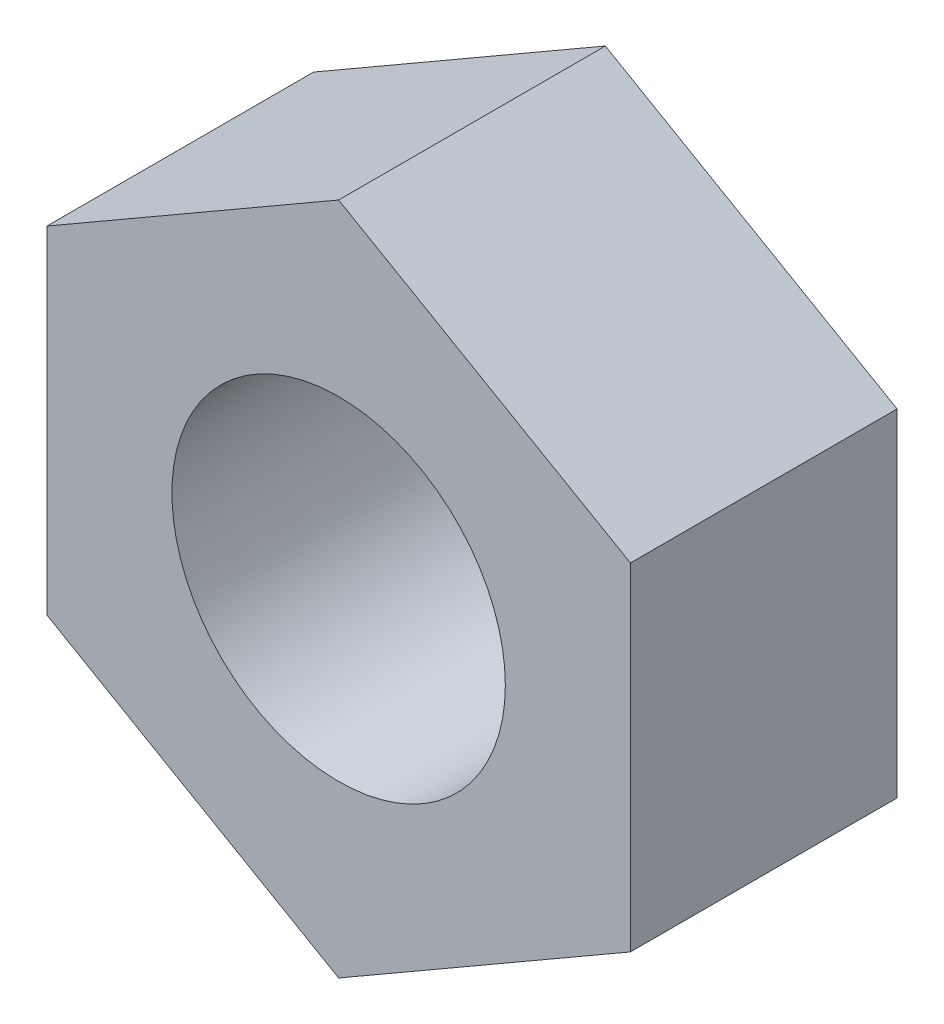
ISO-10303-21;
HEADER;
FILE_DESCRIPTION(('STEP AP214'),'2;1');
FILE_NAME('part.step','',(''),(''),'','','');
FILE_SCHEMA(('AUTOMOTIVE_DESIGN { 1 0 10303 214 1 1 1 1 }'));
ENDSEC;
DATA;
#1=APPLICATION_CONTEXT('core data for automotive mechanical design processes');
#2=APPLICATION_PROTOCOL_DEFINITION('international standard','automotive_design',2000,#1);
#3=PRODUCT_CONTEXT('',#1,'mechanical');
#4=PRODUCT('Part','Part','',(#3));
#5=PRODUCT_RELATED_PRODUCT_CATEGORY('part','',(#4));
#6=PRODUCT_DEFINITION_FORMATION('','',#4);
#7=PRODUCT_DEFINITION_CONTEXT('part definition',#1,'design');
#8=PRODUCT_DEFINITION('design','',#6,#7);
#9=PRODUCT_DEFINITION_SHAPE('','',#8);
#10=(LENGTH_UNIT() NAMED_UNIT(*) SI_UNIT(.MILLI.,.METRE.));
#11=(NAMED_UNIT(*) PLANE_ANGLE_UNIT() SI_UNIT($,.RADIAN.));
#12=(NAMED_UNIT(*) SI_UNIT($,.STERADIAN.) SOLID_ANGLE_UNIT());
#13=UNCERTAINTY_MEASURE_WITH_UNIT(LENGTH_MEASURE(1.E-05),#10,'distance_accuracy_value','');
#14=(GEOMETRIC_REPRESENTATION_CONTEXT(3) GLOBAL_UNCERTAINTY_ASSIGNED_CONTEXT((#13)) GLOBAL_UNIT_ASSIGNED_CONTEXT((#10,
#11,#12)) REPRESENTATION_CONTEXT('',''));
#15=CARTESIAN_POINT('',(0.,0.,0.));
#16=DIRECTION('',(0.,0.,1.));
#17=DIRECTION('',(1.,0.,0.));
#18=AXIS2_PLACEMENT_3D('',#15,#16,#17);
#19=CARTESIAN_POINT('',(0.,0.,2.4));
#20=DIRECTION('',(0.,0.,1.));
#21=DIRECTION('',(1.,0.,0.));
#22=AXIS2_PLACEMENT_3D('',#19,#20,#21);
#23=PLANE('',#22);
#24=DIRECTION('',(-0.866025403784439,0.5,0.));
#25=VECTOR('',#24,1.);
#26=CARTESIAN_POINT('',(2.625,1.51554445662277,2.4));
#27=LINE('',#26,#25);
#28=CARTESIAN_POINT('',(2.625,1.51554445662277,2.4));
#29=VERTEX_POINT('',#28);
#30=CARTESIAN_POINT('',(0.,3.03108891324554,2.4));
#31=VERTEX_POINT('',#30);
#32=EDGE_CURVE('E152',#29,#31,#27,.T.);
#33=ORIENTED_EDGE('',*,*,#32,.T.);
#34=DIRECTION('',(-0.866025403784439,-0.5,0.));
#35=VECTOR('',#34,1.);
#36=CARTESIAN_POINT('',(0.,3.03108891324554,2.4));
#37=LINE('',#36,#35);
#38=CARTESIAN_POINT('',(-2.625,1.51554445662277,2.4));
#39=VERTEX_POINT('',#38);
#40=EDGE_CURVE('E100',#31,#39,#37,.T.);
#41=ORIENTED_EDGE('',*,*,#40,.T.);
#42=DIRECTION('',(0.,-1.,0.));
#43=VECTOR('',#42,1.);
#44=CARTESIAN_POINT('',(-2.625,1.51554445662277,2.4));
#45=LINE('',#44,#43);
#46=CARTESIAN_POINT('',(-2.625,-1.51554445662277,2.4));
#47=VERTEX_POINT('',#46);
#48=EDGE_CURVE('E113',#39,#47,#45,.T.);
#49=ORIENTED_EDGE('',*,*,#48,.T.);
#50=DIRECTION('',(0.866025403784439,-0.5,0.));
#51=VECTOR('',#50,1.);
#52=CARTESIAN_POINT('',(-2.625,-1.51554445662277,2.4));
#53=LINE('',#52,#51);
#54=CARTESIAN_POINT('',(0.,-3.03108891324554,2.4));
#55=VERTEX_POINT('',#54);
#56=EDGE_CURVE('E107',#47,#55,#53,.T.);
#57=ORIENTED_EDGE('',*,*,#56,.T.);
#58=DIRECTION('',(0.866025403784439,0.5,0.));
#59=VECTOR('',#58,1.);
#60=CARTESIAN_POINT('',(0.,-3.03108891324554,2.4));
#61=LINE('',#60,#59);
#62=CARTESIAN_POINT('',(2.625,-1.51554445662277,2.4));
#63=VERTEX_POINT('',#62);
#64=EDGE_CURVE('E111',#55,#63,#61,.T.);
#65=ORIENTED_EDGE('',*,*,#64,.T.);
#66=DIRECTION('',(0.,1.,0.));
#67=VECTOR('',#66,1.);
#68=CARTESIAN_POINT('',(2.625,-1.51554445662277,2.4));
#69=LINE('',#68,#67);
#70=EDGE_CURVE('E63',#63,#29,#69,.T.);
#71=ORIENTED_EDGE('',*,*,#70,.T.);
#72=EDGE_LOOP('',(#33,#41,#49,#57,#65,#71));
#73=FACE_BOUND('',#72,.T.);
#74=CARTESIAN_POINT('',(0.,0.,2.4));
#75=DIRECTION('',(0.,0.,1.));
#76=DIRECTION('',(1.,0.,0.));
#77=AXIS2_PLACEMENT_3D('',#74,#75,#76);
#78=CIRCLE('',#77,1.50000000000006);
#79=CARTESIAN_POINT('',(1.50000000000006,0.,2.4));
#80=VERTEX_POINT('',#79);
#81=EDGE_CURVE('E140',#80,#80,#78,.T.);
#82=ORIENTED_EDGE('',*,*,#81,.F.);
#83=EDGE_LOOP('',(#82));
#84=FACE_BOUND('',#83,.T.);
#85=ADVANCED_FACE('F45',(#73,#84),#23,.T.);
#86=CARTESIAN_POINT('',(0.,0.,0.));
#87=DIRECTION('',(0.,0.,1.));
#88=DIRECTION('',(1.,0.,0.));
#89=AXIS2_PLACEMENT_3D('',#86,#87,#88);
#90=PLANE('',#89);
#91=DIRECTION('',(-0.866025403784439,0.5,0.));
#92=VECTOR('',#91,1.);
#93=CARTESIAN_POINT('',(2.625,1.51554445662277,0.));
#94=LINE('',#93,#92);
#95=CARTESIAN_POINT('',(2.625,1.51554445662277,0.));
#96=VERTEX_POINT('',#95);
#97=CARTESIAN_POINT('',(0.,3.03108891324554,0.));
#98=VERTEX_POINT('',#97);
#99=EDGE_CURVE('E135',#96,#98,#94,.T.);
#100=ORIENTED_EDGE('',*,*,#99,.F.);
#101=DIRECTION('',(0.,1.,0.));
#102=VECTOR('',#101,1.);
#103=CARTESIAN_POINT('',(2.625,-1.51554445662277,0.));
#104=LINE('',#103,#102);
#105=CARTESIAN_POINT('',(2.625,-1.51554445662277,0.));
#106=VERTEX_POINT('',#105);
#107=EDGE_CURVE('E92',#106,#96,#104,.T.);
#108=ORIENTED_EDGE('',*,*,#107,.F.);
#109=DIRECTION('',(0.866025403784439,0.5,0.));
#110=VECTOR('',#109,1.);
#111=CARTESIAN_POINT('',(0.,-3.03108891324554,0.));
#112=LINE('',#111,#110);
#113=CARTESIAN_POINT('',(0.,-3.03108891324554,0.));
#114=VERTEX_POINT('',#113);
#115=EDGE_CURVE('E86',#114,#106,#112,.T.);
#116=ORIENTED_EDGE('',*,*,#115,.F.);
#117=DIRECTION('',(0.866025403784439,-0.5,0.));
#118=VECTOR('',#117,1.);
#119=CARTESIAN_POINT('',(-2.625,-1.51554445662277,0.));
#120=LINE('',#119,#118);
#121=CARTESIAN_POINT('',(-2.625,-1.51554445662277,0.));
#122=VERTEX_POINT('',#121);
#123=EDGE_CURVE('E122',#122,#114,#120,.T.);
#124=ORIENTED_EDGE('',*,*,#123,.F.);
#125=DIRECTION('',(0.,-1.,0.));
#126=VECTOR('',#125,1.);
#127=CARTESIAN_POINT('',(-2.625,1.51554445662277,0.));
#128=LINE('',#127,#126);
#129=CARTESIAN_POINT('',(-2.625,1.51554445662277,0.));
#130=VERTEX_POINT('',#129);
#131=EDGE_CURVE('E143',#130,#122,#128,.T.);
#132=ORIENTED_EDGE('',*,*,#131,.F.);
#133=DIRECTION('',(-0.866025403784439,-0.5,0.));
#134=VECTOR('',#133,1.);
#135=CARTESIAN_POINT('',(0.,3.03108891324554,0.));
#136=LINE('',#135,#134);
#137=EDGE_CURVE('E139',#98,#130,#136,.T.);
#138=ORIENTED_EDGE('',*,*,#137,.F.);
#139=EDGE_LOOP('',(#100,#108,#116,#124,#132,#138));
#140=FACE_BOUND('',#139,.T.);
#141=CARTESIAN_POINT('',(0.,0.,0.));
#142=DIRECTION('',(0.,0.,1.));
#143=DIRECTION('',(1.,0.,0.));
#144=AXIS2_PLACEMENT_3D('',#141,#142,#143);
#145=CIRCLE('',#144,1.50000000000006);
#146=CARTESIAN_POINT('',(1.50000000000006,0.,0.));
#147=VERTEX_POINT('',#146);
#148=EDGE_CURVE('E249',#147,#147,#145,.T.);
#149=ORIENTED_EDGE('',*,*,#148,.T.);
#150=EDGE_LOOP('',(#149));
#151=FACE_BOUND('',#150,.T.);
#152=ADVANCED_FACE('F165',(#140,#151),#90,.F.);
#153=CARTESIAN_POINT('',(2.625,1.51554445662277,2.4));
#154=DIRECTION('',(-0.5,-0.866025403784439,0.));
#155=DIRECTION('',(0.866025403784439,-0.5,0.));
#156=AXIS2_PLACEMENT_3D('',#153,#154,#155);
#157=PLANE('',#156);
#158=ORIENTED_EDGE('',*,*,#99,.T.);
#159=DIRECTION('',(0.,0.,-1.));
#160=VECTOR('',#159,1.);
#161=CARTESIAN_POINT('',(0.,3.03108891324554,2.4));
#162=LINE('',#161,#160);
#163=EDGE_CURVE('E11',#31,#98,#162,.T.);
#164=ORIENTED_EDGE('',*,*,#163,.F.);
#165=ORIENTED_EDGE('',*,*,#32,.F.);
#166=DIRECTION('',(0.,0.,-1.));
#167=VECTOR('',#166,1.);
#168=CARTESIAN_POINT('',(2.625,1.51554445662277,2.4));
#169=LINE('',#168,#167);
#170=EDGE_CURVE('E131',#29,#96,#169,.T.);
#171=ORIENTED_EDGE('',*,*,#170,.T.);
#172=EDGE_LOOP('',(#158,#164,#165,#171));
#173=FACE_BOUND('',#172,.T.);
#174=ADVANCED_FACE('F47',(#173),#157,.F.);
#175=CARTESIAN_POINT('',(0.,3.03108891324554,2.4));
#176=DIRECTION('',(0.5,-0.866025403784439,0.));
#177=DIRECTION('',(0.866025403784439,0.5,0.));
#178=AXIS2_PLACEMENT_3D('',#175,#176,#177);
#179=PLANE('',#178);
#180=ORIENTED_EDGE('',*,*,#137,.T.);
#181=DIRECTION('',(0.,0.,-1.));
#182=VECTOR('',#181,1.);
#183=CARTESIAN_POINT('',(-2.625,1.51554445662277,2.4));
#184=LINE('',#183,#182);
#185=EDGE_CURVE('E55',#39,#130,#184,.T.);
#186=ORIENTED_EDGE('',*,*,#185,.F.);
#187=ORIENTED_EDGE('',*,*,#40,.F.);
#188=ORIENTED_EDGE('',*,*,#163,.T.);
#189=EDGE_LOOP('',(#180,#186,#187,#188));
#190=FACE_BOUND('',#189,.T.);
#191=ADVANCED_FACE('F190',(#190),#179,.F.);
#192=CARTESIAN_POINT('',(-2.625,1.51554445662277,2.4));
#193=DIRECTION('',(1.,0.,0.));
#194=DIRECTION('',(0.,0.,-1.));
#195=AXIS2_PLACEMENT_3D('',#192,#193,#194);
#196=PLANE('',#195);
#197=ORIENTED_EDGE('',*,*,#131,.T.);
#198=DIRECTION('',(0.,0.,-1.));
#199=VECTOR('',#198,1.);
#200=CARTESIAN_POINT('',(-2.625,-1.51554445662277,2.4));
#201=LINE('',#200,#199);
#202=EDGE_CURVE('E124',#47,#122,#201,.T.);
#203=ORIENTED_EDGE('',*,*,#202,.F.);
#204=ORIENTED_EDGE('',*,*,#48,.F.);
#205=ORIENTED_EDGE('',*,*,#185,.T.);
#206=EDGE_LOOP('',(#197,#203,#204,#205));
#207=FACE_BOUND('',#206,.T.);
#208=ADVANCED_FACE('F162',(#207),#196,.F.);
#209=CARTESIAN_POINT('',(-2.625,-1.51554445662277,2.4));
#210=DIRECTION('',(0.5,0.866025403784439,0.));
#211=DIRECTION('',(-0.866025403784439,0.5,0.));
#212=AXIS2_PLACEMENT_3D('',#209,#210,#211);
#213=PLANE('',#212);
#214=ORIENTED_EDGE('',*,*,#123,.T.);
#215=DIRECTION('',(0.,0.,-1.));
#216=VECTOR('',#215,1.);
#217=CARTESIAN_POINT('',(0.,-3.03108891324554,2.4));
#218=LINE('',#217,#216);
#219=EDGE_CURVE('E119',#55,#114,#218,.T.);
#220=ORIENTED_EDGE('',*,*,#219,.F.);
#221=ORIENTED_EDGE('',*,*,#56,.F.);
#222=ORIENTED_EDGE('',*,*,#202,.T.);
#223=EDGE_LOOP('',(#214,#220,#221,#222));
#224=FACE_BOUND('',#223,.T.);
#225=ADVANCED_FACE('F120',(#224),#213,.F.);
#226=CARTESIAN_POINT('',(0.,-3.03108891324554,2.4));
#227=DIRECTION('',(-0.5,0.866025403784439,0.));
#228=DIRECTION('',(-0.866025403784439,-0.5,0.));
#229=AXIS2_PLACEMENT_3D('',#226,#227,#228);
#230=PLANE('',#229);
#231=ORIENTED_EDGE('',*,*,#115,.T.);
#232=DIRECTION('',(0.,0.,-1.));
#233=VECTOR('',#232,1.);
#234=CARTESIAN_POINT('',(2.625,-1.51554445662277,2.4));
#235=LINE('',#234,#233);
#236=EDGE_CURVE('E125',#63,#106,#235,.T.);
#237=ORIENTED_EDGE('',*,*,#236,.F.);
#238=ORIENTED_EDGE('',*,*,#64,.F.);
#239=ORIENTED_EDGE('',*,*,#219,.T.);
#240=EDGE_LOOP('',(#231,#237,#238,#239));
#241=FACE_BOUND('',#240,.T.);
#242=ADVANCED_FACE('F127',(#241),#230,.F.);
#243=CARTESIAN_POINT('',(2.625,-1.51554445662277,2.4));
#244=DIRECTION('',(-1.,0.,0.));
#245=DIRECTION('',(0.,-1.,0.));
#246=AXIS2_PLACEMENT_3D('',#243,#244,#245);
#247=PLANE('',#246);
#248=ORIENTED_EDGE('',*,*,#107,.T.);
#249=ORIENTED_EDGE('',*,*,#170,.F.);
#250=ORIENTED_EDGE('',*,*,#70,.F.);
#251=ORIENTED_EDGE('',*,*,#236,.T.);
#252=EDGE_LOOP('',(#248,#249,#250,#251));
#253=FACE_BOUND('',#252,.T.);
#254=ADVANCED_FACE('F170',(#253),#247,.F.);
#255=CARTESIAN_POINT('',(0.,0.,2.4));
#256=DIRECTION('',(0.,0.,-1.));
#257=DIRECTION('',(-1.,0.,0.));
#258=AXIS2_PLACEMENT_3D('',#255,#256,#257);
#259=CYLINDRICAL_SURFACE('',#258,1.50000000000006);
#260=ORIENTED_EDGE('',*,*,#81,.T.);
#261=EDGE_LOOP('',(#260));
#262=FACE_BOUND('',#261,.T.);
#263=ORIENTED_EDGE('',*,*,#148,.F.);
#264=EDGE_LOOP('',(#263));
#265=FACE_BOUND('',#264,.T.);
#266=ADVANCED_FACE('F172',(#262,#265),#259,.F.);
#267=CLOSED_SHELL('',(#85,#152,#174,#191,#208,#225,#242,#254,#266));
#268=MANIFOLD_SOLID_BREP('B2',#267);
#269=ADVANCED_BREP_SHAPE_REPRESENTATION('',(#18,#268),#14);
#270=SHAPE_DEFINITION_REPRESENTATION(#9,#269);
ENDSEC;
END-ISO-10303-21;
